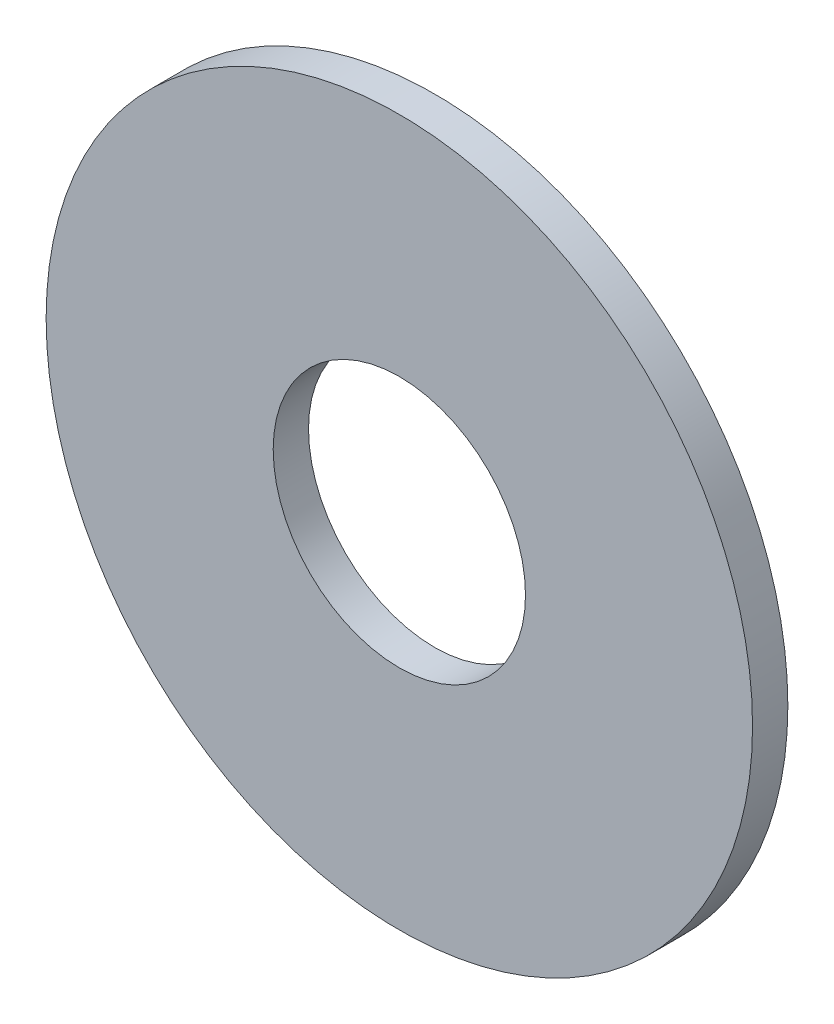
ISO-10303-21;
HEADER;
FILE_DESCRIPTION(('STEP AP214'),'2;1');
FILE_NAME('part.step','',(''),(''),'','','');
FILE_SCHEMA(('AUTOMOTIVE_DESIGN { 1 0 10303 214 1 1 1 1 }'));
ENDSEC;
DATA;
#1=APPLICATION_CONTEXT('core data for automotive mechanical design processes');
#2=APPLICATION_PROTOCOL_DEFINITION('international standard','automotive_design',2000,#1);
#3=PRODUCT_CONTEXT('',#1,'mechanical');
#4=PRODUCT('Part','Part','',(#3));
#5=PRODUCT_RELATED_PRODUCT_CATEGORY('part','',(#4));
#6=PRODUCT_DEFINITION_FORMATION('','',#4);
#7=PRODUCT_DEFINITION_CONTEXT('part definition',#1,'design');
#8=PRODUCT_DEFINITION('design','',#6,#7);
#9=PRODUCT_DEFINITION_SHAPE('','',#8);
#10=(LENGTH_UNIT() NAMED_UNIT(*) SI_UNIT(.MILLI.,.METRE.));
#11=(NAMED_UNIT(*) PLANE_ANGLE_UNIT() SI_UNIT($,.RADIAN.));
#12=(NAMED_UNIT(*) SI_UNIT($,.STERADIAN.) SOLID_ANGLE_UNIT());
#13=UNCERTAINTY_MEASURE_WITH_UNIT(LENGTH_MEASURE(1.E-05),#10,'distance_accuracy_value','');
#14=(GEOMETRIC_REPRESENTATION_CONTEXT(3) GLOBAL_UNCERTAINTY_ASSIGNED_CONTEXT((#13)) GLOBAL_UNIT_ASSIGNED_CONTEXT((#10,
#11,#12)) REPRESENTATION_CONTEXT('',''));
#15=CARTESIAN_POINT('',(0.,0.,0.));
#16=DIRECTION('',(0.,0.,1.));
#17=DIRECTION('',(1.,0.,0.));
#18=AXIS2_PLACEMENT_3D('',#15,#16,#17);
#19=CARTESIAN_POINT('',(0.,0.,0.7));
#20=DIRECTION('',(0.,0.,-1.));
#21=DIRECTION('',(-1.,0.,0.));
#22=AXIS2_PLACEMENT_3D('',#19,#20,#21);
#23=CYLINDRICAL_SURFACE('',#22,7.);
#24=CARTESIAN_POINT('',(0.,0.,0.7));
#25=DIRECTION('',(0.,0.,1.));
#26=DIRECTION('',(1.,0.,0.));
#27=AXIS2_PLACEMENT_3D('',#24,#25,#26);
#28=CIRCLE('',#27,7.);
#29=CARTESIAN_POINT('',(7.,0.,0.7));
#30=VERTEX_POINT('',#29);
#31=EDGE_CURVE('E10',#30,#30,#28,.T.);
#32=ORIENTED_EDGE('',*,*,#31,.F.);
#33=EDGE_LOOP('',(#32));
#34=FACE_BOUND('',#33,.T.);
#35=CARTESIAN_POINT('',(0.,0.,0.));
#36=DIRECTION('',(0.,0.,1.));
#37=DIRECTION('',(1.,0.,0.));
#38=AXIS2_PLACEMENT_3D('',#35,#36,#37);
#39=CIRCLE('',#38,7.);
#40=CARTESIAN_POINT('',(7.,0.,0.));
#41=VERTEX_POINT('',#40);
#42=EDGE_CURVE('E42',#41,#41,#39,.T.);
#43=ORIENTED_EDGE('',*,*,#42,.T.);
#44=EDGE_LOOP('',(#43));
#45=FACE_BOUND('',#44,.T.);
#46=ADVANCED_FACE('F35',(#34,#45),#23,.T.);
#47=CARTESIAN_POINT('',(0.,0.,0.7));
#48=DIRECTION('',(0.,0.,1.));
#49=DIRECTION('',(1.,0.,0.));
#50=AXIS2_PLACEMENT_3D('',#47,#48,#49);
#51=PLANE('',#50);
#52=CARTESIAN_POINT('',(0.,0.,0.7));
#53=DIRECTION('',(0.,0.,1.));
#54=DIRECTION('',(1.,0.,0.));
#55=AXIS2_PLACEMENT_3D('',#52,#53,#54);
#56=CIRCLE('',#55,2.5);
#57=CARTESIAN_POINT('',(2.5,0.,0.7));
#58=VERTEX_POINT('',#57);
#59=EDGE_CURVE('E48',#58,#58,#56,.T.);
#60=ORIENTED_EDGE('',*,*,#59,.F.);
#61=EDGE_LOOP('',(#60));
#62=FACE_BOUND('',#61,.T.);
#63=ORIENTED_EDGE('',*,*,#31,.T.);
#64=EDGE_LOOP('',(#63));
#65=FACE_BOUND('',#64,.T.);
#66=ADVANCED_FACE('F64',(#62,#65),#51,.T.);
#67=CARTESIAN_POINT('',(0.,0.,0.));
#68=DIRECTION('',(0.,0.,1.));
#69=DIRECTION('',(1.,0.,0.));
#70=AXIS2_PLACEMENT_3D('',#67,#68,#69);
#71=PLANE('',#70);
#72=CARTESIAN_POINT('',(0.,0.,0.));
#73=DIRECTION('',(0.,0.,1.));
#74=DIRECTION('',(1.,0.,0.));
#75=AXIS2_PLACEMENT_3D('',#72,#73,#74);
#76=CIRCLE('',#75,2.5);
#77=CARTESIAN_POINT('',(2.5,0.,0.));
#78=VERTEX_POINT('',#77);
#79=EDGE_CURVE('E38',#78,#78,#76,.T.);
#80=ORIENTED_EDGE('',*,*,#79,.T.);
#81=EDGE_LOOP('',(#80));
#82=FACE_BOUND('',#81,.T.);
#83=ORIENTED_EDGE('',*,*,#42,.F.);
#84=EDGE_LOOP('',(#83));
#85=FACE_BOUND('',#84,.T.);
#86=ADVANCED_FACE('F55',(#82,#85),#71,.F.);
#87=CARTESIAN_POINT('',(0.,0.,-0.8));
#88=DIRECTION('',(0.,0.,1.));
#89=DIRECTION('',(1.,0.,0.));
#90=AXIS2_PLACEMENT_3D('',#87,#88,#89);
#91=CYLINDRICAL_SURFACE('',#90,2.5);
#92=ORIENTED_EDGE('',*,*,#59,.T.);
#93=EDGE_LOOP('',(#92));
#94=FACE_BOUND('',#93,.T.);
#95=ORIENTED_EDGE('',*,*,#79,.F.);
#96=EDGE_LOOP('',(#95));
#97=FACE_BOUND('',#96,.T.);
#98=ADVANCED_FACE('F58',(#94,#97),#91,.F.);
#99=CLOSED_SHELL('',(#46,#66,#86,#98));
#100=MANIFOLD_SOLID_BREP('B2',#99);
#101=ADVANCED_BREP_SHAPE_REPRESENTATION('',(#18,#100),#14);
#102=SHAPE_DEFINITION_REPRESENTATION(#9,#101);
ENDSEC;
END-ISO-10303-21;
